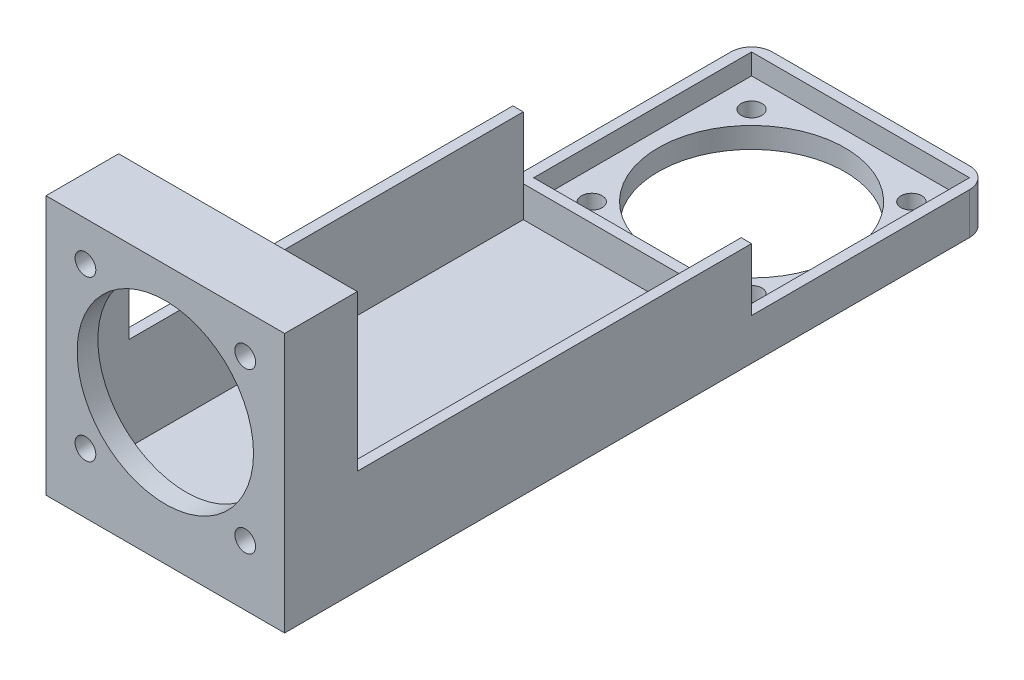
ISO-10303-21;
HEADER;
FILE_DESCRIPTION(('STEP AP214'),'2;1');
FILE_NAME('part.step','',(''),(''),'','','');
FILE_SCHEMA(('AUTOMOTIVE_DESIGN { 1 0 10303 214 1 1 1 1 }'));
ENDSEC;
DATA;
#1=APPLICATION_CONTEXT('core data for automotive mechanical design processes');
#2=APPLICATION_PROTOCOL_DEFINITION('international standard','automotive_design',2000,#1);
#3=PRODUCT_CONTEXT('',#1,'mechanical');
#4=PRODUCT('Part','Part','',(#3));
#5=PRODUCT_RELATED_PRODUCT_CATEGORY('part','',(#4));
#6=PRODUCT_DEFINITION_FORMATION('','',#4);
#7=PRODUCT_DEFINITION_CONTEXT('part definition',#1,'design');
#8=PRODUCT_DEFINITION('design','',#6,#7);
#9=PRODUCT_DEFINITION_SHAPE('','',#8);
#10=(LENGTH_UNIT() NAMED_UNIT(*) SI_UNIT(.MILLI.,.METRE.));
#11=(NAMED_UNIT(*) PLANE_ANGLE_UNIT() SI_UNIT($,.RADIAN.));
#12=(NAMED_UNIT(*) SI_UNIT($,.STERADIAN.) SOLID_ANGLE_UNIT());
#13=UNCERTAINTY_MEASURE_WITH_UNIT(LENGTH_MEASURE(1.E-05),#10,'distance_accuracy_value','');
#14=(GEOMETRIC_REPRESENTATION_CONTEXT(3) GLOBAL_UNCERTAINTY_ASSIGNED_CONTEXT((#13)) GLOBAL_UNIT_ASSIGNED_CONTEXT((#10,
#11,#12)) REPRESENTATION_CONTEXT('',''));
#15=CARTESIAN_POINT('',(0.,0.,0.));
#16=DIRECTION('',(0.,0.,1.));
#17=DIRECTION('',(1.,0.,0.));
#18=AXIS2_PLACEMENT_3D('',#15,#16,#17);
#19=CARTESIAN_POINT('',(21.,10.,46.));
#20=DIRECTION('',(0.,-1.,0.));
#21=DIRECTION('',(0.,0.,-1.));
#22=AXIS2_PLACEMENT_3D('',#19,#20,#21);
#23=PLANE('',#22);
#24=DIRECTION('',(-1.,0.,0.));
#25=VECTOR('',#24,1.);
#26=CARTESIAN_POINT('',(22.,10.,39.));
#27=LINE('',#26,#25);
#28=CARTESIAN_POINT('',(22.,10.,39.));
#29=VERTEX_POINT('',#28);
#30=CARTESIAN_POINT('',(21.,10.,39.));
#31=VERTEX_POINT('',#30);
#32=EDGE_CURVE('E224',#29,#31,#27,.T.);
#33=ORIENTED_EDGE('',*,*,#32,.F.);
#34=DIRECTION('',(0.,0.,-1.));
#35=VECTOR('',#34,1.);
#36=CARTESIAN_POINT('',(22.,10.,46.));
#37=LINE('',#36,#35);
#38=CARTESIAN_POINT('',(22.,10.,1.));
#39=VERTEX_POINT('',#38);
#40=EDGE_CURVE('E240',#29,#39,#37,.T.);
#41=ORIENTED_EDGE('',*,*,#40,.T.);
#42=DIRECTION('',(-1.,0.,0.));
#43=VECTOR('',#42,1.);
#44=CARTESIAN_POINT('',(21.,10.,1.));
#45=LINE('',#44,#43);
#46=CARTESIAN_POINT('',(21.,10.,1.));
#47=VERTEX_POINT('',#46);
#48=EDGE_CURVE('E237',#39,#47,#45,.T.);
#49=ORIENTED_EDGE('',*,*,#48,.T.);
#50=DIRECTION('',(0.,0.,-1.));
#51=VECTOR('',#50,1.);
#52=CARTESIAN_POINT('',(21.,10.,46.));
#53=LINE('',#52,#51);
#54=EDGE_CURVE('E216',#31,#47,#53,.T.);
#55=ORIENTED_EDGE('',*,*,#54,.F.);
#56=EDGE_LOOP('',(#33,#41,#49,#55));
#57=FACE_BOUND('',#56,.T.);
#58=ADVANCED_FACE('F65',(#57),#23,.F.);
#59=CARTESIAN_POINT('',(-1.,10.,46.));
#60=DIRECTION('',(0.,-1.,0.));
#61=DIRECTION('',(0.,0.,-1.));
#62=AXIS2_PLACEMENT_3D('',#59,#60,#61);
#63=PLANE('',#62);
#64=DIRECTION('',(-1.,0.,0.));
#65=VECTOR('',#64,1.);
#66=CARTESIAN_POINT('',(-1.,10.,39.));
#67=LINE('',#66,#65);
#68=CARTESIAN_POINT('',(0.,10.,39.));
#69=VERTEX_POINT('',#68);
#70=CARTESIAN_POINT('',(-1.,10.,39.));
#71=VERTEX_POINT('',#70);
#72=EDGE_CURVE('E424',#69,#71,#67,.T.);
#73=ORIENTED_EDGE('',*,*,#72,.F.);
#74=DIRECTION('',(0.,0.,-1.));
#75=VECTOR('',#74,1.);
#76=CARTESIAN_POINT('',(0.,10.,46.));
#77=LINE('',#76,#75);
#78=CARTESIAN_POINT('',(0.,10.,1.));
#79=VERTEX_POINT('',#78);
#80=EDGE_CURVE('E384',#69,#79,#77,.T.);
#81=ORIENTED_EDGE('',*,*,#80,.T.);
#82=DIRECTION('',(-1.,0.,0.));
#83=VECTOR('',#82,1.);
#84=CARTESIAN_POINT('',(-1.,10.,1.));
#85=LINE('',#84,#83);
#86=CARTESIAN_POINT('',(-1.,10.,1.));
#87=VERTEX_POINT('',#86);
#88=EDGE_CURVE('E410',#79,#87,#85,.T.);
#89=ORIENTED_EDGE('',*,*,#88,.T.);
#90=DIRECTION('',(0.,0.,-1.));
#91=VECTOR('',#90,1.);
#92=CARTESIAN_POINT('',(-1.,10.,46.));
#93=LINE('',#92,#91);
#94=EDGE_CURVE('E379',#71,#87,#93,.T.);
#95=ORIENTED_EDGE('',*,*,#94,.F.);
#96=EDGE_LOOP('',(#73,#81,#89,#95));
#97=FACE_BOUND('',#96,.T.);
#98=ADVANCED_FACE('F420',(#97),#63,.F.);
#99=CARTESIAN_POINT('',(22.,25.,44.));
#100=DIRECTION('',(0.,0.,1.));
#101=DIRECTION('',(1.,0.,0.));
#102=AXIS2_PLACEMENT_3D('',#99,#100,#101);
#103=PLANE('',#102);
#104=CARTESIAN_POINT('',(18.2,21.2,44.));
#105=DIRECTION('',(0.,0.,1.));
#106=DIRECTION('',(1.,0.,0.));
#107=AXIS2_PLACEMENT_3D('',#104,#105,#106);
#108=CIRCLE('',#107,1.);
#109=CARTESIAN_POINT('',(19.2,21.2,44.));
#110=VERTEX_POINT('',#109);
#111=EDGE_CURVE('E458',#110,#110,#108,.T.);
#112=ORIENTED_EDGE('',*,*,#111,.T.);
#113=EDGE_LOOP('',(#112));
#114=FACE_BOUND('',#113,.T.);
#115=CARTESIAN_POINT('',(18.2,5.8,44.));
#116=DIRECTION('',(0.,0.,1.));
#117=DIRECTION('',(1.,0.,0.));
#118=AXIS2_PLACEMENT_3D('',#115,#116,#117);
#119=CIRCLE('',#118,1.);
#120=CARTESIAN_POINT('',(19.2,5.8,44.));
#121=VERTEX_POINT('',#120);
#122=EDGE_CURVE('E887',#121,#121,#119,.T.);
#123=ORIENTED_EDGE('',*,*,#122,.T.);
#124=EDGE_LOOP('',(#123));
#125=FACE_BOUND('',#124,.T.);
#126=CARTESIAN_POINT('',(10.5,13.5,44.));
#127=DIRECTION('',(0.,0.,1.));
#128=DIRECTION('',(1.,0.,0.));
#129=AXIS2_PLACEMENT_3D('',#126,#127,#128);
#130=CIRCLE('',#129,8.5);
#131=CARTESIAN_POINT('',(19.,13.5,44.));
#132=VERTEX_POINT('',#131);
#133=EDGE_CURVE('E891',#132,#132,#130,.T.);
#134=ORIENTED_EDGE('',*,*,#133,.T.);
#135=EDGE_LOOP('',(#134));
#136=FACE_BOUND('',#135,.T.);
#137=CARTESIAN_POINT('',(2.8,5.8,44.));
#138=DIRECTION('',(0.,0.,1.));
#139=DIRECTION('',(1.,0.,0.));
#140=AXIS2_PLACEMENT_3D('',#137,#138,#139);
#141=CIRCLE('',#140,1.);
#142=CARTESIAN_POINT('',(3.8,5.8,44.));
#143=VERTEX_POINT('',#142);
#144=EDGE_CURVE('E903',#143,#143,#141,.T.);
#145=ORIENTED_EDGE('',*,*,#144,.T.);
#146=EDGE_LOOP('',(#145));
#147=FACE_BOUND('',#146,.T.);
#148=CARTESIAN_POINT('',(2.8,21.2,44.));
#149=DIRECTION('',(0.,0.,1.));
#150=DIRECTION('',(1.,0.,0.));
#151=AXIS2_PLACEMENT_3D('',#148,#149,#150);
#152=CIRCLE('',#151,1.);
#153=CARTESIAN_POINT('',(3.8,21.2,44.));
#154=VERTEX_POINT('',#153);
#155=EDGE_CURVE('E907',#154,#154,#152,.T.);
#156=ORIENTED_EDGE('',*,*,#155,.T.);
#157=EDGE_LOOP('',(#156));
#158=FACE_BOUND('',#157,.T.);
#159=DIRECTION('',(-1.,0.,0.));
#160=VECTOR('',#159,1.);
#161=CARTESIAN_POINT('',(0.,24.,44.));
#162=LINE('',#161,#160);
#163=CARTESIAN_POINT('',(21.,24.,44.));
#164=VERTEX_POINT('',#163);
#165=CARTESIAN_POINT('',(0.,24.,44.));
#166=VERTEX_POINT('',#165);
#167=EDGE_CURVE('E234',#164,#166,#162,.T.);
#168=ORIENTED_EDGE('',*,*,#167,.F.);
#169=DIRECTION('',(0.,-1.,0.));
#170=VECTOR('',#169,1.);
#171=CARTESIAN_POINT('',(21.,1.,44.));
#172=LINE('',#171,#170);
#173=CARTESIAN_POINT('',(21.,1.,44.));
#174=VERTEX_POINT('',#173);
#175=EDGE_CURVE('E395',#164,#174,#172,.T.);
#176=ORIENTED_EDGE('',*,*,#175,.T.);
#177=DIRECTION('',(-1.,0.,0.));
#178=VECTOR('',#177,1.);
#179=CARTESIAN_POINT('',(22.,1.,44.));
#180=LINE('',#179,#178);
#181=CARTESIAN_POINT('',(0.,1.,44.));
#182=VERTEX_POINT('',#181);
#183=EDGE_CURVE('E496',#174,#182,#180,.T.);
#184=ORIENTED_EDGE('',*,*,#183,.T.);
#185=DIRECTION('',(0.,1.,0.));
#186=VECTOR('',#185,1.);
#187=CARTESIAN_POINT('',(0.,10.,44.));
#188=LINE('',#187,#186);
#189=EDGE_CURVE('E504',#182,#166,#188,.T.);
#190=ORIENTED_EDGE('',*,*,#189,.T.);
#191=EDGE_LOOP('',(#168,#176,#184,#190));
#192=FACE_BOUND('',#191,.T.);
#193=ADVANCED_FACE('F544',(#114,#125,#136,#147,#158,#192),#103,.F.);
#194=CARTESIAN_POINT('',(21.,1.,46.));
#195=DIRECTION('',(1.,0.,0.));
#196=DIRECTION('',(0.,0.,-1.));
#197=AXIS2_PLACEMENT_3D('',#194,#195,#196);
#198=PLANE('',#197);
#199=ORIENTED_EDGE('',*,*,#175,.F.);
#200=DIRECTION('',(0.,0.,1.));
#201=VECTOR('',#200,1.);
#202=CARTESIAN_POINT('',(21.,24.,39.));
#203=LINE('',#202,#201);
#204=CARTESIAN_POINT('',(21.,24.,39.));
#205=VERTEX_POINT('',#204);
#206=EDGE_CURVE('E219',#205,#164,#203,.T.);
#207=ORIENTED_EDGE('',*,*,#206,.F.);
#208=DIRECTION('',(0.,1.,0.));
#209=VECTOR('',#208,1.);
#210=CARTESIAN_POINT('',(21.,24.,39.));
#211=LINE('',#210,#209);
#212=EDGE_CURVE('E211',#31,#205,#211,.T.);
#213=ORIENTED_EDGE('',*,*,#212,.F.);
#214=ORIENTED_EDGE('',*,*,#54,.T.);
#215=DIRECTION('',(0.,-1.,0.));
#216=VECTOR('',#215,1.);
#217=CARTESIAN_POINT('',(21.,1.,1.));
#218=LINE('',#217,#216);
#219=CARTESIAN_POINT('',(21.,4.,1.));
#220=VERTEX_POINT('',#219);
#221=EDGE_CURVE('E76',#47,#220,#218,.T.);
#222=ORIENTED_EDGE('',*,*,#221,.T.);
#223=CARTESIAN_POINT('',(21.,1.,1.));
#224=VERTEX_POINT('',#223);
#225=EDGE_CURVE('E12',#220,#224,#218,.T.);
#226=ORIENTED_EDGE('',*,*,#225,.T.);
#227=DIRECTION('',(0.,0.,-1.));
#228=VECTOR('',#227,1.);
#229=CARTESIAN_POINT('',(21.,1.,46.));
#230=LINE('',#229,#228);
#231=EDGE_CURVE('E241',#174,#224,#230,.T.);
#232=ORIENTED_EDGE('',*,*,#231,.F.);
#233=EDGE_LOOP('',(#199,#207,#213,#214,#222,#226,#232));
#234=FACE_BOUND('',#233,.T.);
#235=ADVANCED_FACE('F213',(#234),#198,.F.);
#236=CARTESIAN_POINT('',(0.,1.,46.));
#237=DIRECTION('',(0.,-1.,0.));
#238=DIRECTION('',(0.,0.,-1.));
#239=AXIS2_PLACEMENT_3D('',#236,#237,#238);
#240=PLANE('',#239);
#241=ORIENTED_EDGE('',*,*,#183,.F.);
#242=ORIENTED_EDGE('',*,*,#231,.T.);
#243=DIRECTION('',(-1.,0.,0.));
#244=VECTOR('',#243,1.);
#245=CARTESIAN_POINT('',(0.,1.,1.));
#246=LINE('',#245,#244);
#247=CARTESIAN_POINT('',(0.,1.,1.));
#248=VERTEX_POINT('',#247);
#249=EDGE_CURVE('E402',#224,#248,#246,.T.);
#250=ORIENTED_EDGE('',*,*,#249,.T.);
#251=DIRECTION('',(0.,0.,-1.));
#252=VECTOR('',#251,1.);
#253=CARTESIAN_POINT('',(0.,1.,46.));
#254=LINE('',#253,#252);
#255=EDGE_CURVE('E83',#182,#248,#254,.T.);
#256=ORIENTED_EDGE('',*,*,#255,.F.);
#257=EDGE_LOOP('',(#241,#242,#250,#256));
#258=FACE_BOUND('',#257,.T.);
#259=ADVANCED_FACE('F524',(#258),#240,.F.);
#260=CARTESIAN_POINT('',(0.,10.,46.));
#261=DIRECTION('',(-1.,0.,0.));
#262=DIRECTION('',(0.,-1.,0.));
#263=AXIS2_PLACEMENT_3D('',#260,#261,#262);
#264=PLANE('',#263);
#265=ORIENTED_EDGE('',*,*,#189,.F.);
#266=ORIENTED_EDGE('',*,*,#255,.T.);
#267=DIRECTION('',(0.,1.,0.));
#268=VECTOR('',#267,1.);
#269=CARTESIAN_POINT('',(0.,10.,1.));
#270=LINE('',#269,#268);
#271=CARTESIAN_POINT('',(0.,4.,1.));
#272=VERTEX_POINT('',#271);
#273=EDGE_CURVE('E407',#248,#272,#270,.T.);
#274=ORIENTED_EDGE('',*,*,#273,.T.);
#275=EDGE_CURVE('E406',#272,#79,#270,.T.);
#276=ORIENTED_EDGE('',*,*,#275,.T.);
#277=ORIENTED_EDGE('',*,*,#80,.F.);
#278=DIRECTION('',(0.,-1.,0.));
#279=VECTOR('',#278,1.);
#280=CARTESIAN_POINT('',(0.,10.,39.));
#281=LINE('',#280,#279);
#282=CARTESIAN_POINT('',(0.,24.,39.));
#283=VERTEX_POINT('',#282);
#284=EDGE_CURVE('E448',#283,#69,#281,.T.);
#285=ORIENTED_EDGE('',*,*,#284,.F.);
#286=DIRECTION('',(0.,0.,1.));
#287=VECTOR('',#286,1.);
#288=CARTESIAN_POINT('',(0.,24.,39.));
#289=LINE('',#288,#287);
#290=EDGE_CURVE('E454',#283,#166,#289,.T.);
#291=ORIENTED_EDGE('',*,*,#290,.T.);
#292=EDGE_LOOP('',(#265,#266,#274,#276,#277,#285,#291));
#293=FACE_BOUND('',#292,.T.);
#294=ADVANCED_FACE('F427',(#293),#264,.F.);
#295=CARTESIAN_POINT('',(-1.,4.,1.));
#296=DIRECTION('',(0.,0.,-1.));
#297=DIRECTION('',(-1.,0.,0.));
#298=AXIS2_PLACEMENT_3D('',#295,#296,#297);
#299=PLANE('',#298);
#300=ORIENTED_EDGE('',*,*,#273,.F.);
#301=ORIENTED_EDGE('',*,*,#249,.F.);
#302=ORIENTED_EDGE('',*,*,#225,.F.);
#303=DIRECTION('',(1.,0.,0.));
#304=VECTOR('',#303,1.);
#305=CARTESIAN_POINT('',(-1.,4.,1.));
#306=LINE('',#305,#304);
#307=EDGE_CURVE('E318',#272,#220,#306,.T.);
#308=ORIENTED_EDGE('',*,*,#307,.F.);
#309=EDGE_LOOP('',(#300,#301,#302,#308));
#310=FACE_BOUND('',#309,.T.);
#311=ADVANCED_FACE('F525',(#310),#299,.F.);
#312=CARTESIAN_POINT('',(0.,4.,0.));
#313=DIRECTION('',(1.,0.,0.));
#314=DIRECTION('',(0.,0.,-1.));
#315=AXIS2_PLACEMENT_3D('',#312,#313,#314);
#316=PLANE('',#315);
#317=DIRECTION('',(0.,-1.,0.));
#318=VECTOR('',#317,1.);
#319=CARTESIAN_POINT('',(0.,4.,0.));
#320=LINE('',#319,#318);
#321=CARTESIAN_POINT('',(0.,4.,0.));
#322=VERTEX_POINT('',#321);
#323=CARTESIAN_POINT('',(0.,2.,0.));
#324=VERTEX_POINT('',#323);
#325=EDGE_CURVE('E296',#322,#324,#320,.T.);
#326=ORIENTED_EDGE('',*,*,#325,.T.);
#327=DIRECTION('',(0.,0.,1.));
#328=VECTOR('',#327,1.);
#329=CARTESIAN_POINT('',(0.,2.,-21.));
#330=LINE('',#329,#328);
#331=CARTESIAN_POINT('',(0.,2.,-21.));
#332=VERTEX_POINT('',#331);
#333=EDGE_CURVE('E268',#332,#324,#330,.T.);
#334=ORIENTED_EDGE('',*,*,#333,.F.);
#335=DIRECTION('',(0.,-1.,0.));
#336=VECTOR('',#335,1.);
#337=CARTESIAN_POINT('',(0.,4.,-21.));
#338=LINE('',#337,#336);
#339=CARTESIAN_POINT('',(0.,4.,-21.));
#340=VERTEX_POINT('',#339);
#341=EDGE_CURVE('E284',#340,#332,#338,.T.);
#342=ORIENTED_EDGE('',*,*,#341,.F.);
#343=DIRECTION('',(0.,0.,1.));
#344=VECTOR('',#343,1.);
#345=CARTESIAN_POINT('',(0.,4.,0.));
#346=LINE('',#345,#344);
#347=EDGE_CURVE('E271',#340,#322,#346,.T.);
#348=ORIENTED_EDGE('',*,*,#347,.T.);
#349=EDGE_LOOP('',(#326,#334,#342,#348));
#350=FACE_BOUND('',#349,.T.);
#351=ADVANCED_FACE('F527',(#350),#316,.T.);
#352=CARTESIAN_POINT('',(0.,4.,0.));
#353=DIRECTION('',(0.,0.,-1.));
#354=DIRECTION('',(-1.,0.,0.));
#355=AXIS2_PLACEMENT_3D('',#352,#353,#354);
#356=PLANE('',#355);
#357=DIRECTION('',(0.,-1.,0.));
#358=VECTOR('',#357,1.);
#359=CARTESIAN_POINT('',(21.,4.,0.));
#360=LINE('',#359,#358);
#361=CARTESIAN_POINT('',(21.,4.,0.));
#362=VERTEX_POINT('',#361);
#363=CARTESIAN_POINT('',(21.,2.,0.));
#364=VERTEX_POINT('',#363);
#365=EDGE_CURVE('E292',#362,#364,#360,.T.);
#366=ORIENTED_EDGE('',*,*,#365,.T.);
#367=DIRECTION('',(1.,0.,0.));
#368=VECTOR('',#367,1.);
#369=CARTESIAN_POINT('',(0.,2.,0.));
#370=LINE('',#369,#368);
#371=EDGE_CURVE('E254',#324,#364,#370,.T.);
#372=ORIENTED_EDGE('',*,*,#371,.F.);
#373=ORIENTED_EDGE('',*,*,#325,.F.);
#374=DIRECTION('',(1.,0.,0.));
#375=VECTOR('',#374,1.);
#376=CARTESIAN_POINT('',(0.,4.,0.));
#377=LINE('',#376,#375);
#378=EDGE_CURVE('E274',#322,#362,#377,.T.);
#379=ORIENTED_EDGE('',*,*,#378,.T.);
#380=EDGE_LOOP('',(#366,#372,#373,#379));
#381=FACE_BOUND('',#380,.T.);
#382=ADVANCED_FACE('F533',(#381),#356,.T.);
#383=CARTESIAN_POINT('',(21.,4.,0.));
#384=DIRECTION('',(-1.,0.,0.));
#385=DIRECTION('',(0.,0.,1.));
#386=AXIS2_PLACEMENT_3D('',#383,#384,#385);
#387=PLANE('',#386);
#388=DIRECTION('',(0.,-1.,0.));
#389=VECTOR('',#388,1.);
#390=CARTESIAN_POINT('',(21.,4.,-21.));
#391=LINE('',#390,#389);
#392=CARTESIAN_POINT('',(21.,4.,-21.));
#393=VERTEX_POINT('',#392);
#394=CARTESIAN_POINT('',(21.,2.,-21.));
#395=VERTEX_POINT('',#394);
#396=EDGE_CURVE('E288',#393,#395,#391,.T.);
#397=ORIENTED_EDGE('',*,*,#396,.T.);
#398=DIRECTION('',(0.,0.,1.));
#399=VECTOR('',#398,1.);
#400=CARTESIAN_POINT('',(21.,2.,-21.));
#401=LINE('',#400,#399);
#402=EDGE_CURVE('E260',#395,#364,#401,.T.);
#403=ORIENTED_EDGE('',*,*,#402,.T.);
#404=ORIENTED_EDGE('',*,*,#365,.F.);
#405=DIRECTION('',(0.,0.,-1.));
#406=VECTOR('',#405,1.);
#407=CARTESIAN_POINT('',(21.,4.,0.));
#408=LINE('',#407,#406);
#409=EDGE_CURVE('E277',#362,#393,#408,.T.);
#410=ORIENTED_EDGE('',*,*,#409,.T.);
#411=EDGE_LOOP('',(#397,#403,#404,#410));
#412=FACE_BOUND('',#411,.T.);
#413=ADVANCED_FACE('F560',(#412),#387,.T.);
#414=CARTESIAN_POINT('',(0.,4.,-21.));
#415=DIRECTION('',(0.,0.,1.));
#416=DIRECTION('',(1.,0.,0.));
#417=AXIS2_PLACEMENT_3D('',#414,#415,#416);
#418=PLANE('',#417);
#419=ORIENTED_EDGE('',*,*,#341,.T.);
#420=DIRECTION('',(1.,0.,0.));
#421=VECTOR('',#420,1.);
#422=CARTESIAN_POINT('',(0.,2.,-21.));
#423=LINE('',#422,#421);
#424=EDGE_CURVE('E264',#332,#395,#423,.T.);
#425=ORIENTED_EDGE('',*,*,#424,.T.);
#426=ORIENTED_EDGE('',*,*,#396,.F.);
#427=DIRECTION('',(-1.,0.,0.));
#428=VECTOR('',#427,1.);
#429=CARTESIAN_POINT('',(0.,4.,-21.));
#430=LINE('',#429,#428);
#431=EDGE_CURVE('E281',#393,#340,#430,.T.);
#432=ORIENTED_EDGE('',*,*,#431,.T.);
#433=EDGE_LOOP('',(#419,#425,#426,#432));
#434=FACE_BOUND('',#433,.T.);
#435=ADVANCED_FACE('F557',(#434),#418,.T.);
#436=CARTESIAN_POINT('',(0.,4.,0.));
#437=DIRECTION('',(0.,-1.,0.));
#438=DIRECTION('',(0.,0.,-1.));
#439=AXIS2_PLACEMENT_3D('',#436,#437,#438);
#440=PLANE('',#439);
#441=DIRECTION('',(0.,0.,-1.));
#442=VECTOR('',#441,1.);
#443=CARTESIAN_POINT('',(22.,4.,1.));
#444=LINE('',#443,#442);
#445=CARTESIAN_POINT('',(22.,4.,1.));
#446=VERTEX_POINT('',#445);
#447=CARTESIAN_POINT('',(22.,4.,-20.));
#448=VERTEX_POINT('',#447);
#449=EDGE_CURVE('E301',#446,#448,#444,.T.);
#450=ORIENTED_EDGE('',*,*,#449,.T.);
#451=CARTESIAN_POINT('',(20.,4.,-20.));
#452=DIRECTION('',(0.,-1.,0.));
#453=DIRECTION('',(0.,0.,-1.));
#454=AXIS2_PLACEMENT_3D('',#451,#452,#453);
#455=CIRCLE('',#454,2.);
#456=CARTESIAN_POINT('',(20.,4.,-22.));
#457=VERTEX_POINT('',#456);
#458=EDGE_CURVE('E69',#448,#457,#455,.F.);
#459=ORIENTED_EDGE('',*,*,#458,.T.);
#460=DIRECTION('',(-1.,0.,0.));
#461=VECTOR('',#460,1.);
#462=CARTESIAN_POINT('',(-1.,4.,-22.));
#463=LINE('',#462,#461);
#464=CARTESIAN_POINT('',(1.,4.,-22.));
#465=VERTEX_POINT('',#464);
#466=EDGE_CURVE('E305',#457,#465,#463,.T.);
#467=ORIENTED_EDGE('',*,*,#466,.T.);
#468=CARTESIAN_POINT('',(1.,4.,-20.));
#469=DIRECTION('',(0.,-1.,0.));
#470=DIRECTION('',(0.,0.,-1.));
#471=AXIS2_PLACEMENT_3D('',#468,#469,#470);
#472=CIRCLE('',#471,2.);
#473=CARTESIAN_POINT('',(-1.,4.,-20.));
#474=VERTEX_POINT('',#473);
#475=EDGE_CURVE('E339',#465,#474,#472,.F.);
#476=ORIENTED_EDGE('',*,*,#475,.T.);
#477=DIRECTION('',(0.,0.,1.));
#478=VECTOR('',#477,1.);
#479=CARTESIAN_POINT('',(-1.,4.,1.));
#480=LINE('',#479,#478);
#481=CARTESIAN_POINT('',(-1.,4.,1.));
#482=VERTEX_POINT('',#481);
#483=EDGE_CURVE('E309',#474,#482,#480,.T.);
#484=ORIENTED_EDGE('',*,*,#483,.T.);
#485=EDGE_CURVE('E313',#482,#272,#306,.T.);
#486=ORIENTED_EDGE('',*,*,#485,.T.);
#487=ORIENTED_EDGE('',*,*,#307,.T.);
#488=EDGE_CURVE('E312',#220,#446,#306,.T.);
#489=ORIENTED_EDGE('',*,*,#488,.T.);
#490=EDGE_LOOP('',(#450,#459,#467,#476,#484,#486,#487,#489));
#491=FACE_BOUND('',#490,.T.);
#492=ORIENTED_EDGE('',*,*,#347,.F.);
#493=ORIENTED_EDGE('',*,*,#431,.F.);
#494=ORIENTED_EDGE('',*,*,#409,.F.);
#495=ORIENTED_EDGE('',*,*,#378,.F.);
#496=EDGE_LOOP('',(#492,#493,#494,#495));
#497=FACE_BOUND('',#496,.T.);
#498=ADVANCED_FACE('F357',(#491,#497),#440,.F.);
#499=CARTESIAN_POINT('',(0.,0.,0.));
#500=DIRECTION('',(0.,-1.,0.));
#501=DIRECTION('',(0.,0.,-1.));
#502=AXIS2_PLACEMENT_3D('',#499,#500,#501);
#503=PLANE('',#502);
#504=CARTESIAN_POINT('',(18.2,0.,-18.2));
#505=DIRECTION('',(0.,-1.,0.));
#506=DIRECTION('',(0.,0.,-1.));
#507=AXIS2_PLACEMENT_3D('',#504,#505,#506);
#508=CIRCLE('',#507,1.);
#509=CARTESIAN_POINT('',(18.2,0.,-19.2));
#510=VERTEX_POINT('',#509);
#511=EDGE_CURVE('E492',#510,#510,#508,.T.);
#512=ORIENTED_EDGE('',*,*,#511,.F.);
#513=EDGE_LOOP('',(#512));
#514=FACE_BOUND('',#513,.T.);
#515=CARTESIAN_POINT('',(18.2,0.,-2.8));
#516=DIRECTION('',(0.,-1.,0.));
#517=DIRECTION('',(0.,0.,-1.));
#518=AXIS2_PLACEMENT_3D('',#515,#516,#517);
#519=CIRCLE('',#518,1.);
#520=CARTESIAN_POINT('',(18.2,0.,-3.8));
#521=VERTEX_POINT('',#520);
#522=EDGE_CURVE('E488',#521,#521,#519,.T.);
#523=ORIENTED_EDGE('',*,*,#522,.F.);
#524=EDGE_LOOP('',(#523));
#525=FACE_BOUND('',#524,.T.);
#526=CARTESIAN_POINT('',(2.8,0.,-2.8));
#527=DIRECTION('',(0.,-1.,0.));
#528=DIRECTION('',(0.,0.,-1.));
#529=AXIS2_PLACEMENT_3D('',#526,#527,#528);
#530=CIRCLE('',#529,1.);
#531=CARTESIAN_POINT('',(2.8,0.,-3.8));
#532=VERTEX_POINT('',#531);
#533=EDGE_CURVE('E484',#532,#532,#530,.T.);
#534=ORIENTED_EDGE('',*,*,#533,.F.);
#535=EDGE_LOOP('',(#534));
#536=FACE_BOUND('',#535,.T.);
#537=CARTESIAN_POINT('',(2.8,0.,-18.2));
#538=DIRECTION('',(0.,-1.,0.));
#539=DIRECTION('',(0.,0.,-1.));
#540=AXIS2_PLACEMENT_3D('',#537,#538,#539);
#541=CIRCLE('',#540,1.);
#542=CARTESIAN_POINT('',(2.8,0.,-19.2));
#543=VERTEX_POINT('',#542);
#544=EDGE_CURVE('E480',#543,#543,#541,.T.);
#545=ORIENTED_EDGE('',*,*,#544,.F.);
#546=EDGE_LOOP('',(#545));
#547=FACE_BOUND('',#546,.T.);
#548=CARTESIAN_POINT('',(10.5,0.,-10.5));
#549=DIRECTION('',(0.,1.,0.));
#550=DIRECTION('',(0.,0.,1.));
#551=AXIS2_PLACEMENT_3D('',#548,#549,#550);
#552=CIRCLE('',#551,9.00000000000001);
#553=CARTESIAN_POINT('',(10.5,0.,-1.49999999999999));
#554=VERTEX_POINT('',#553);
#555=EDGE_CURVE('E250',#554,#554,#552,.T.);
#556=ORIENTED_EDGE('',*,*,#555,.T.);
#557=EDGE_LOOP('',(#556));
#558=FACE_BOUND('',#557,.T.);
#559=DIRECTION('',(-1.,0.,0.));
#560=VECTOR('',#559,1.);
#561=CARTESIAN_POINT('',(-1.,0.,-22.));
#562=LINE('',#561,#560);
#563=CARTESIAN_POINT('',(20.,0.,-22.));
#564=VERTEX_POINT('',#563);
#565=CARTESIAN_POINT('',(1.,0.,-22.));
#566=VERTEX_POINT('',#565);
#567=EDGE_CURVE('E322',#564,#566,#562,.T.);
#568=ORIENTED_EDGE('',*,*,#567,.F.);
#569=CARTESIAN_POINT('',(20.,0.,-20.));
#570=DIRECTION('',(0.,-1.,0.));
#571=DIRECTION('',(0.,0.,-1.));
#572=AXIS2_PLACEMENT_3D('',#569,#570,#571);
#573=CIRCLE('',#572,2.);
#574=CARTESIAN_POINT('',(22.,0.,-20.));
#575=VERTEX_POINT('',#574);
#576=EDGE_CURVE('E346',#564,#575,#573,.T.);
#577=ORIENTED_EDGE('',*,*,#576,.T.);
#578=DIRECTION('',(0.,0.,-1.));
#579=VECTOR('',#578,1.);
#580=CARTESIAN_POINT('',(22.,0.,1.));
#581=LINE('',#580,#579);
#582=CARTESIAN_POINT('',(22.,0.,46.));
#583=VERTEX_POINT('',#582);
#584=EDGE_CURVE('E300',#583,#575,#581,.T.);
#585=ORIENTED_EDGE('',*,*,#584,.F.);
#586=DIRECTION('',(1.,0.,0.));
#587=VECTOR('',#586,1.);
#588=CARTESIAN_POINT('',(-1.,0.,46.));
#589=LINE('',#588,#587);
#590=CARTESIAN_POINT('',(-1.,0.,46.));
#591=VERTEX_POINT('',#590);
#592=EDGE_CURVE('E380',#591,#583,#589,.T.);
#593=ORIENTED_EDGE('',*,*,#592,.F.);
#594=DIRECTION('',(0.,0.,1.));
#595=VECTOR('',#594,1.);
#596=CARTESIAN_POINT('',(-1.,0.,1.));
#597=LINE('',#596,#595);
#598=CARTESIAN_POINT('',(-1.,0.,-20.));
#599=VERTEX_POINT('',#598);
#600=EDGE_CURVE('E306',#599,#591,#597,.T.);
#601=ORIENTED_EDGE('',*,*,#600,.F.);
#602=CARTESIAN_POINT('',(1.,0.,-20.));
#603=DIRECTION('',(0.,-1.,0.));
#604=DIRECTION('',(0.,0.,-1.));
#605=AXIS2_PLACEMENT_3D('',#602,#603,#604);
#606=CIRCLE('',#605,2.);
#607=EDGE_CURVE('E331',#599,#566,#606,.T.);
#608=ORIENTED_EDGE('',*,*,#607,.T.);
#609=EDGE_LOOP('',(#568,#577,#585,#593,#601,#608));
#610=FACE_BOUND('',#609,.T.);
#611=ADVANCED_FACE('F367',(#514,#525,#536,#547,#558,#610),#503,.T.);
#612=CARTESIAN_POINT('',(22.,4.,1.));
#613=DIRECTION('',(-1.,0.,0.));
#614=DIRECTION('',(0.,0.,1.));
#615=AXIS2_PLACEMENT_3D('',#612,#613,#614);
#616=PLANE('',#615);
#617=ORIENTED_EDGE('',*,*,#40,.F.);
#618=DIRECTION('',(0.,-1.,0.));
#619=VECTOR('',#618,1.);
#620=CARTESIAN_POINT('',(22.,10.,39.));
#621=LINE('',#620,#619);
#622=CARTESIAN_POINT('',(22.,25.,39.));
#623=VERTEX_POINT('',#622);
#624=EDGE_CURVE('E230',#623,#29,#621,.T.);
#625=ORIENTED_EDGE('',*,*,#624,.F.);
#626=DIRECTION('',(0.,0.,-1.));
#627=VECTOR('',#626,1.);
#628=CARTESIAN_POINT('',(22.,25.,46.));
#629=LINE('',#628,#627);
#630=CARTESIAN_POINT('',(22.,25.,46.));
#631=VERTEX_POINT('',#630);
#632=EDGE_CURVE('E374',#631,#623,#629,.T.);
#633=ORIENTED_EDGE('',*,*,#632,.F.);
#634=DIRECTION('',(0.,1.,0.));
#635=VECTOR('',#634,1.);
#636=CARTESIAN_POINT('',(22.,0.,46.));
#637=LINE('',#636,#635);
#638=EDGE_CURVE('E373',#583,#631,#637,.T.);
#639=ORIENTED_EDGE('',*,*,#638,.F.);
#640=ORIENTED_EDGE('',*,*,#584,.T.);
#641=DIRECTION('',(0.,-1.,0.));
#642=VECTOR('',#641,1.);
#643=CARTESIAN_POINT('',(22.,4.,-20.));
#644=LINE('',#643,#642);
#645=EDGE_CURVE('E348',#575,#448,#644,.F.);
#646=ORIENTED_EDGE('',*,*,#645,.T.);
#647=ORIENTED_EDGE('',*,*,#449,.F.);
#648=DIRECTION('',(0.,1.,0.));
#649=VECTOR('',#648,1.);
#650=CARTESIAN_POINT('',(22.,0.,1.));
#651=LINE('',#650,#649);
#652=EDGE_CURVE('E394',#446,#39,#651,.T.);
#653=ORIENTED_EDGE('',*,*,#652,.T.);
#654=EDGE_LOOP('',(#617,#625,#633,#639,#640,#646,#647,#653));
#655=FACE_BOUND('',#654,.T.);
#656=ADVANCED_FACE('F371',(#655),#616,.F.);
#657=CARTESIAN_POINT('',(-1.,4.,-22.));
#658=DIRECTION('',(0.,0.,1.));
#659=DIRECTION('',(1.,0.,0.));
#660=AXIS2_PLACEMENT_3D('',#657,#658,#659);
#661=PLANE('',#660);
#662=ORIENTED_EDGE('',*,*,#466,.F.);
#663=DIRECTION('',(0.,-1.,0.));
#664=VECTOR('',#663,1.);
#665=CARTESIAN_POINT('',(20.,4.,-22.));
#666=LINE('',#665,#664);
#667=EDGE_CURVE('E342',#457,#564,#666,.T.);
#668=ORIENTED_EDGE('',*,*,#667,.T.);
#669=ORIENTED_EDGE('',*,*,#567,.T.);
#670=DIRECTION('',(0.,-1.,0.));
#671=VECTOR('',#670,1.);
#672=CARTESIAN_POINT('',(1.,4.,-22.));
#673=LINE('',#672,#671);
#674=EDGE_CURVE('E335',#566,#465,#673,.F.);
#675=ORIENTED_EDGE('',*,*,#674,.T.);
#676=EDGE_LOOP('',(#662,#668,#669,#675));
#677=FACE_BOUND('',#676,.T.);
#678=ADVANCED_FACE('F362',(#677),#661,.F.);
#679=CARTESIAN_POINT('',(-1.,4.,1.));
#680=DIRECTION('',(1.,0.,0.));
#681=DIRECTION('',(0.,0.,-1.));
#682=AXIS2_PLACEMENT_3D('',#679,#680,#681);
#683=PLANE('',#682);
#684=DIRECTION('',(0.,1.,0.));
#685=VECTOR('',#684,1.);
#686=CARTESIAN_POINT('',(-1.,25.,39.));
#687=LINE('',#686,#685);
#688=CARTESIAN_POINT('',(-1.,25.,39.));
#689=VERTEX_POINT('',#688);
#690=EDGE_CURVE('E438',#71,#689,#687,.T.);
#691=ORIENTED_EDGE('',*,*,#690,.F.);
#692=ORIENTED_EDGE('',*,*,#94,.T.);
#693=DIRECTION('',(0.,-1.,0.));
#694=VECTOR('',#693,1.);
#695=CARTESIAN_POINT('',(-1.,0.,1.));
#696=LINE('',#695,#694);
#697=EDGE_CURVE('E390',#87,#482,#696,.T.);
#698=ORIENTED_EDGE('',*,*,#697,.T.);
#699=ORIENTED_EDGE('',*,*,#483,.F.);
#700=DIRECTION('',(0.,-1.,0.));
#701=VECTOR('',#700,1.);
#702=CARTESIAN_POINT('',(-1.,4.,-20.));
#703=LINE('',#702,#701);
#704=EDGE_CURVE('E317',#474,#599,#703,.T.);
#705=ORIENTED_EDGE('',*,*,#704,.T.);
#706=ORIENTED_EDGE('',*,*,#600,.T.);
#707=DIRECTION('',(0.,-1.,0.));
#708=VECTOR('',#707,1.);
#709=CARTESIAN_POINT('',(-1.,0.,46.));
#710=LINE('',#709,#708);
#711=CARTESIAN_POINT('',(-1.,25.,46.));
#712=VERTEX_POINT('',#711);
#713=EDGE_CURVE('E386',#712,#591,#710,.T.);
#714=ORIENTED_EDGE('',*,*,#713,.F.);
#715=DIRECTION('',(0.,0.,1.));
#716=VECTOR('',#715,1.);
#717=CARTESIAN_POINT('',(-1.,25.,44.));
#718=LINE('',#717,#716);
#719=EDGE_CURVE('E440',#689,#712,#718,.T.);
#720=ORIENTED_EDGE('',*,*,#719,.F.);
#721=EDGE_LOOP('',(#691,#692,#698,#699,#705,#706,#714,#720));
#722=FACE_BOUND('',#721,.T.);
#723=ADVANCED_FACE('F435',(#722),#683,.F.);
#724=CARTESIAN_POINT('',(0.,2.,0.));
#725=DIRECTION('',(0.,-1.,0.));
#726=DIRECTION('',(0.,0.,-1.));
#727=AXIS2_PLACEMENT_3D('',#724,#725,#726);
#728=PLANE('',#727);
#729=CARTESIAN_POINT('',(18.2,2.,-18.2));
#730=DIRECTION('',(0.,1.,0.));
#731=DIRECTION('',(0.,0.,1.));
#732=AXIS2_PLACEMENT_3D('',#729,#730,#731);
#733=CIRCLE('',#732,1.);
#734=CARTESIAN_POINT('',(18.2,2.,-17.2));
#735=VERTEX_POINT('',#734);
#736=EDGE_CURVE('E464',#735,#735,#733,.T.);
#737=ORIENTED_EDGE('',*,*,#736,.F.);
#738=EDGE_LOOP('',(#737));
#739=FACE_BOUND('',#738,.T.);
#740=CARTESIAN_POINT('',(18.2,2.,-2.8));
#741=DIRECTION('',(0.,1.,0.));
#742=DIRECTION('',(0.,0.,1.));
#743=AXIS2_PLACEMENT_3D('',#740,#741,#742);
#744=CIRCLE('',#743,1.);
#745=CARTESIAN_POINT('',(18.2,2.,-1.8));
#746=VERTEX_POINT('',#745);
#747=EDGE_CURVE('E470',#746,#746,#744,.T.);
#748=ORIENTED_EDGE('',*,*,#747,.F.);
#749=EDGE_LOOP('',(#748));
#750=FACE_BOUND('',#749,.T.);
#751=CARTESIAN_POINT('',(2.8,2.,-2.8));
#752=DIRECTION('',(0.,1.,0.));
#753=DIRECTION('',(0.,0.,1.));
#754=AXIS2_PLACEMENT_3D('',#751,#752,#753);
#755=CIRCLE('',#754,1.);
#756=CARTESIAN_POINT('',(2.8,2.,-1.8));
#757=VERTEX_POINT('',#756);
#758=EDGE_CURVE('E465',#757,#757,#755,.T.);
#759=ORIENTED_EDGE('',*,*,#758,.F.);
#760=EDGE_LOOP('',(#759));
#761=FACE_BOUND('',#760,.T.);
#762=CARTESIAN_POINT('',(2.8,2.,-18.2));
#763=DIRECTION('',(0.,1.,0.));
#764=DIRECTION('',(0.,0.,1.));
#765=AXIS2_PLACEMENT_3D('',#762,#763,#764);
#766=CIRCLE('',#765,1.);
#767=CARTESIAN_POINT('',(2.8,2.,-17.2));
#768=VERTEX_POINT('',#767);
#769=EDGE_CURVE('E469',#768,#768,#766,.T.);
#770=ORIENTED_EDGE('',*,*,#769,.F.);
#771=EDGE_LOOP('',(#770));
#772=FACE_BOUND('',#771,.T.);
#773=CARTESIAN_POINT('',(10.5,2.,-10.5));
#774=DIRECTION('',(0.,1.,0.));
#775=DIRECTION('',(0.,0.,1.));
#776=AXIS2_PLACEMENT_3D('',#773,#774,#775);
#777=CIRCLE('',#776,9.00000000000001);
#778=CARTESIAN_POINT('',(10.5,2.,-1.49999999999999));
#779=VERTEX_POINT('',#778);
#780=EDGE_CURVE('E245',#779,#779,#777,.T.);
#781=ORIENTED_EDGE('',*,*,#780,.F.);
#782=EDGE_LOOP('',(#781));
#783=FACE_BOUND('',#782,.T.);
#784=ORIENTED_EDGE('',*,*,#371,.T.);
#785=ORIENTED_EDGE('',*,*,#402,.F.);
#786=ORIENTED_EDGE('',*,*,#424,.F.);
#787=ORIENTED_EDGE('',*,*,#333,.T.);
#788=EDGE_LOOP('',(#784,#785,#786,#787));
#789=FACE_BOUND('',#788,.T.);
#790=ADVANCED_FACE('F552',(#739,#750,#761,#772,#783,#789),#728,.F.);
#791=CARTESIAN_POINT('',(10.5,0.,-10.5));
#792=DIRECTION('',(0.,1.,0.));
#793=DIRECTION('',(0.,0.,1.));
#794=AXIS2_PLACEMENT_3D('',#791,#792,#793);
#795=CYLINDRICAL_SURFACE('',#794,9.00000000000001);
#796=ORIENTED_EDGE('',*,*,#555,.F.);
#797=EDGE_LOOP('',(#796));
#798=FACE_BOUND('',#797,.T.);
#799=ORIENTED_EDGE('',*,*,#780,.T.);
#800=EDGE_LOOP('',(#799));
#801=FACE_BOUND('',#800,.T.);
#802=ADVANCED_FACE('F549',(#798,#801),#795,.F.);
#803=CARTESIAN_POINT('',(1.,4.,-20.));
#804=DIRECTION('',(0.,-1.,0.));
#805=DIRECTION('',(0.,0.,-1.));
#806=AXIS2_PLACEMENT_3D('',#803,#804,#805);
#807=CYLINDRICAL_SURFACE('',#806,2.);
#808=ORIENTED_EDGE('',*,*,#475,.F.);
#809=ORIENTED_EDGE('',*,*,#674,.F.);
#810=ORIENTED_EDGE('',*,*,#607,.F.);
#811=ORIENTED_EDGE('',*,*,#704,.F.);
#812=EDGE_LOOP('',(#808,#809,#810,#811));
#813=FACE_BOUND('',#812,.T.);
#814=ADVANCED_FACE('F514',(#813),#807,.T.);
#815=CARTESIAN_POINT('',(20.,4.,-20.));
#816=DIRECTION('',(0.,-1.,0.));
#817=DIRECTION('',(0.,0.,-1.));
#818=AXIS2_PLACEMENT_3D('',#815,#816,#817);
#819=CYLINDRICAL_SURFACE('',#818,2.);
#820=ORIENTED_EDGE('',*,*,#458,.F.);
#821=ORIENTED_EDGE('',*,*,#645,.F.);
#822=ORIENTED_EDGE('',*,*,#576,.F.);
#823=ORIENTED_EDGE('',*,*,#667,.F.);
#824=EDGE_LOOP('',(#820,#821,#822,#823));
#825=FACE_BOUND('',#824,.T.);
#826=ADVANCED_FACE('F67',(#825),#819,.T.);
#827=CARTESIAN_POINT('',(0.,0.,1.));
#828=DIRECTION('',(0.,0.,-1.));
#829=DIRECTION('',(-1.,0.,0.));
#830=AXIS2_PLACEMENT_3D('',#827,#828,#829);
#831=PLANE('',#830);
#832=ORIENTED_EDGE('',*,*,#485,.F.);
#833=ORIENTED_EDGE('',*,*,#697,.F.);
#834=ORIENTED_EDGE('',*,*,#88,.F.);
#835=ORIENTED_EDGE('',*,*,#275,.F.);
#836=EDGE_LOOP('',(#832,#833,#834,#835));
#837=FACE_BOUND('',#836,.T.);
#838=ADVANCED_FACE('F431',(#837),#831,.T.);
#839=ORIENTED_EDGE('',*,*,#488,.F.);
#840=ORIENTED_EDGE('',*,*,#221,.F.);
#841=ORIENTED_EDGE('',*,*,#48,.F.);
#842=ORIENTED_EDGE('',*,*,#652,.F.);
#843=EDGE_LOOP('',(#839,#840,#841,#842));
#844=FACE_BOUND('',#843,.T.);
#845=ADVANCED_FACE('F519',(#844),#831,.T.);
#846=CARTESIAN_POINT('',(0.,0.,46.));
#847=DIRECTION('',(0.,0.,-1.));
#848=DIRECTION('',(-1.,0.,0.));
#849=AXIS2_PLACEMENT_3D('',#846,#847,#848);
#850=PLANE('',#849);
#851=CARTESIAN_POINT('',(18.2,21.2,46.));
#852=DIRECTION('',(0.,0.,1.));
#853=DIRECTION('',(1.,0.,0.));
#854=AXIS2_PLACEMENT_3D('',#851,#852,#853);
#855=CIRCLE('',#854,1.);
#856=CARTESIAN_POINT('',(19.2,21.2,46.));
#857=VERTEX_POINT('',#856);
#858=EDGE_CURVE('E883',#857,#857,#855,.T.);
#859=ORIENTED_EDGE('',*,*,#858,.F.);
#860=EDGE_LOOP('',(#859));
#861=FACE_BOUND('',#860,.T.);
#862=CARTESIAN_POINT('',(18.2,5.8,46.));
#863=DIRECTION('',(0.,0.,1.));
#864=DIRECTION('',(1.,0.,0.));
#865=AXIS2_PLACEMENT_3D('',#862,#863,#864);
#866=CIRCLE('',#865,1.);
#867=CARTESIAN_POINT('',(19.2,5.8,46.));
#868=VERTEX_POINT('',#867);
#869=EDGE_CURVE('E915',#868,#868,#866,.T.);
#870=ORIENTED_EDGE('',*,*,#869,.F.);
#871=EDGE_LOOP('',(#870));
#872=FACE_BOUND('',#871,.T.);
#873=CARTESIAN_POINT('',(10.5,13.5,46.));
#874=DIRECTION('',(0.,0.,1.));
#875=DIRECTION('',(1.,0.,0.));
#876=AXIS2_PLACEMENT_3D('',#873,#874,#875);
#877=CIRCLE('',#876,8.5);
#878=CARTESIAN_POINT('',(19.,13.5,46.));
#879=VERTEX_POINT('',#878);
#880=EDGE_CURVE('E925',#879,#879,#877,.T.);
#881=ORIENTED_EDGE('',*,*,#880,.F.);
#882=EDGE_LOOP('',(#881));
#883=FACE_BOUND('',#882,.T.);
#884=CARTESIAN_POINT('',(2.8,5.8,46.));
#885=DIRECTION('',(0.,0.,1.));
#886=DIRECTION('',(1.,0.,0.));
#887=AXIS2_PLACEMENT_3D('',#884,#885,#886);
#888=CIRCLE('',#887,1.);
#889=CARTESIAN_POINT('',(3.8,5.8,46.));
#890=VERTEX_POINT('',#889);
#891=EDGE_CURVE('E919',#890,#890,#888,.T.);
#892=ORIENTED_EDGE('',*,*,#891,.F.);
#893=EDGE_LOOP('',(#892));
#894=FACE_BOUND('',#893,.T.);
#895=CARTESIAN_POINT('',(2.8,21.2,46.));
#896=DIRECTION('',(0.,0.,1.));
#897=DIRECTION('',(1.,0.,0.));
#898=AXIS2_PLACEMENT_3D('',#895,#896,#897);
#899=CIRCLE('',#898,1.);
#900=CARTESIAN_POINT('',(3.8,21.2,46.));
#901=VERTEX_POINT('',#900);
#902=EDGE_CURVE('E911',#901,#901,#899,.T.);
#903=ORIENTED_EDGE('',*,*,#902,.F.);
#904=EDGE_LOOP('',(#903));
#905=FACE_BOUND('',#904,.T.);
#906=DIRECTION('',(1.,0.,0.));
#907=VECTOR('',#906,1.);
#908=CARTESIAN_POINT('',(-1.,25.,46.));
#909=LINE('',#908,#907);
#910=EDGE_CURVE('E499',#712,#631,#909,.T.);
#911=ORIENTED_EDGE('',*,*,#910,.F.);
#912=ORIENTED_EDGE('',*,*,#713,.T.);
#913=ORIENTED_EDGE('',*,*,#592,.T.);
#914=ORIENTED_EDGE('',*,*,#638,.T.);
#915=EDGE_LOOP('',(#911,#912,#913,#914));
#916=FACE_BOUND('',#915,.T.);
#917=ADVANCED_FACE('F511',(#861,#872,#883,#894,#905,#916),#850,.F.);
#918=CARTESIAN_POINT('',(0.,25.,0.));
#919=DIRECTION('',(0.,1.,0.));
#920=DIRECTION('',(0.,0.,1.));
#921=AXIS2_PLACEMENT_3D('',#918,#919,#920);
#922=PLANE('',#921);
#923=ORIENTED_EDGE('',*,*,#719,.T.);
#924=ORIENTED_EDGE('',*,*,#910,.T.);
#925=ORIENTED_EDGE('',*,*,#632,.T.);
#926=DIRECTION('',(1.,0.,0.));
#927=VECTOR('',#926,1.);
#928=CARTESIAN_POINT('',(22.,25.,39.));
#929=LINE('',#928,#927);
#930=EDGE_CURVE('E443',#689,#623,#929,.T.);
#931=ORIENTED_EDGE('',*,*,#930,.F.);
#932=EDGE_LOOP('',(#923,#924,#925,#931));
#933=FACE_BOUND('',#932,.T.);
#934=ADVANCED_FACE('F602',(#933),#922,.T.);
#935=CARTESIAN_POINT('',(2.8,-18.,-18.2));
#936=DIRECTION('',(0.,1.,0.));
#937=DIRECTION('',(0.,0.,1.));
#938=AXIS2_PLACEMENT_3D('',#935,#936,#937);
#939=CYLINDRICAL_SURFACE('',#938,1.);
#940=ORIENTED_EDGE('',*,*,#544,.T.);
#941=EDGE_LOOP('',(#940));
#942=FACE_BOUND('',#941,.T.);
#943=ORIENTED_EDGE('',*,*,#769,.T.);
#944=EDGE_LOOP('',(#943));
#945=FACE_BOUND('',#944,.T.);
#946=ADVANCED_FACE('F598',(#942,#945),#939,.F.);
#947=CARTESIAN_POINT('',(2.8,-18.,-2.8));
#948=DIRECTION('',(0.,1.,0.));
#949=DIRECTION('',(0.,0.,1.));
#950=AXIS2_PLACEMENT_3D('',#947,#948,#949);
#951=CYLINDRICAL_SURFACE('',#950,1.);
#952=ORIENTED_EDGE('',*,*,#533,.T.);
#953=EDGE_LOOP('',(#952));
#954=FACE_BOUND('',#953,.T.);
#955=ORIENTED_EDGE('',*,*,#758,.T.);
#956=EDGE_LOOP('',(#955));
#957=FACE_BOUND('',#956,.T.);
#958=ADVANCED_FACE('F601',(#954,#957),#951,.F.);
#959=CARTESIAN_POINT('',(18.2,-18.,-2.8));
#960=DIRECTION('',(0.,1.,0.));
#961=DIRECTION('',(0.,0.,1.));
#962=AXIS2_PLACEMENT_3D('',#959,#960,#961);
#963=CYLINDRICAL_SURFACE('',#962,1.);
#964=ORIENTED_EDGE('',*,*,#522,.T.);
#965=EDGE_LOOP('',(#964));
#966=FACE_BOUND('',#965,.T.);
#967=ORIENTED_EDGE('',*,*,#747,.T.);
#968=EDGE_LOOP('',(#967));
#969=FACE_BOUND('',#968,.T.);
#970=ADVANCED_FACE('F610',(#966,#969),#963,.F.);
#971=CARTESIAN_POINT('',(18.2,-18.,-18.2));
#972=DIRECTION('',(0.,1.,0.));
#973=DIRECTION('',(0.,0.,1.));
#974=AXIS2_PLACEMENT_3D('',#971,#972,#973);
#975=CYLINDRICAL_SURFACE('',#974,1.);
#976=ORIENTED_EDGE('',*,*,#511,.T.);
#977=EDGE_LOOP('',(#976));
#978=FACE_BOUND('',#977,.T.);
#979=ORIENTED_EDGE('',*,*,#736,.T.);
#980=EDGE_LOOP('',(#979));
#981=FACE_BOUND('',#980,.T.);
#982=ADVANCED_FACE('F616',(#978,#981),#975,.F.);
#983=CARTESIAN_POINT('',(0.,24.,39.));
#984=DIRECTION('',(0.,1.,0.));
#985=DIRECTION('',(-1.,0.,0.));
#986=AXIS2_PLACEMENT_3D('',#983,#984,#985);
#987=PLANE('',#986);
#988=ORIENTED_EDGE('',*,*,#167,.T.);
#989=ORIENTED_EDGE('',*,*,#290,.F.);
#990=DIRECTION('',(-1.,0.,0.));
#991=VECTOR('',#990,1.);
#992=CARTESIAN_POINT('',(0.,24.,39.));
#993=LINE('',#992,#991);
#994=EDGE_CURVE('E223',#205,#283,#993,.T.);
#995=ORIENTED_EDGE('',*,*,#994,.F.);
#996=ORIENTED_EDGE('',*,*,#206,.T.);
#997=EDGE_LOOP('',(#988,#989,#995,#996));
#998=FACE_BOUND('',#997,.T.);
#999=ADVANCED_FACE('F656',(#998),#987,.F.);
#1000=CARTESIAN_POINT('',(0.,0.,39.));
#1001=DIRECTION('',(0.,0.,1.));
#1002=DIRECTION('',(1.,0.,0.));
#1003=AXIS2_PLACEMENT_3D('',#1000,#1001,#1002);
#1004=PLANE('',#1003);
#1005=ORIENTED_EDGE('',*,*,#32,.T.);
#1006=ORIENTED_EDGE('',*,*,#212,.T.);
#1007=ORIENTED_EDGE('',*,*,#994,.T.);
#1008=ORIENTED_EDGE('',*,*,#284,.T.);
#1009=ORIENTED_EDGE('',*,*,#72,.T.);
#1010=ORIENTED_EDGE('',*,*,#690,.T.);
#1011=ORIENTED_EDGE('',*,*,#930,.T.);
#1012=ORIENTED_EDGE('',*,*,#624,.T.);
#1013=EDGE_LOOP('',(#1005,#1006,#1007,#1008,#1009,#1010,#1011,#1012));
#1014=FACE_BOUND('',#1013,.T.);
#1015=ADVANCED_FACE('F227',(#1014),#1004,.F.);
#1016=CARTESIAN_POINT('',(2.8,21.2,41.));
#1017=DIRECTION('',(0.,0.,1.));
#1018=DIRECTION('',(1.,0.,0.));
#1019=AXIS2_PLACEMENT_3D('',#1016,#1017,#1018);
#1020=CYLINDRICAL_SURFACE('',#1019,1.);
#1021=ORIENTED_EDGE('',*,*,#902,.T.);
#1022=EDGE_LOOP('',(#1021));
#1023=FACE_BOUND('',#1022,.T.);
#1024=ORIENTED_EDGE('',*,*,#155,.F.);
#1025=EDGE_LOOP('',(#1024));
#1026=FACE_BOUND('',#1025,.T.);
#1027=ADVANCED_FACE('F828',(#1023,#1026),#1020,.F.);
#1028=CARTESIAN_POINT('',(2.8,5.8,41.));
#1029=DIRECTION('',(0.,0.,1.));
#1030=DIRECTION('',(1.,0.,0.));
#1031=AXIS2_PLACEMENT_3D('',#1028,#1029,#1030);
#1032=CYLINDRICAL_SURFACE('',#1031,1.);
#1033=ORIENTED_EDGE('',*,*,#891,.T.);
#1034=EDGE_LOOP('',(#1033));
#1035=FACE_BOUND('',#1034,.T.);
#1036=ORIENTED_EDGE('',*,*,#144,.F.);
#1037=EDGE_LOOP('',(#1036));
#1038=FACE_BOUND('',#1037,.T.);
#1039=ADVANCED_FACE('F835',(#1035,#1038),#1032,.F.);
#1040=CARTESIAN_POINT('',(10.5,13.5,41.));
#1041=DIRECTION('',(0.,0.,1.));
#1042=DIRECTION('',(1.,0.,0.));
#1043=AXIS2_PLACEMENT_3D('',#1040,#1041,#1042);
#1044=CYLINDRICAL_SURFACE('',#1043,8.5);
#1045=ORIENTED_EDGE('',*,*,#880,.T.);
#1046=EDGE_LOOP('',(#1045));
#1047=FACE_BOUND('',#1046,.T.);
#1048=ORIENTED_EDGE('',*,*,#133,.F.);
#1049=EDGE_LOOP('',(#1048));
#1050=FACE_BOUND('',#1049,.T.);
#1051=ADVANCED_FACE('F844',(#1047,#1050),#1044,.F.);
#1052=CARTESIAN_POINT('',(18.2,5.8,41.));
#1053=DIRECTION('',(0.,0.,1.));
#1054=DIRECTION('',(1.,0.,0.));
#1055=AXIS2_PLACEMENT_3D('',#1052,#1053,#1054);
#1056=CYLINDRICAL_SURFACE('',#1055,1.);
#1057=ORIENTED_EDGE('',*,*,#869,.T.);
#1058=EDGE_LOOP('',(#1057));
#1059=FACE_BOUND('',#1058,.T.);
#1060=ORIENTED_EDGE('',*,*,#122,.F.);
#1061=EDGE_LOOP('',(#1060));
#1062=FACE_BOUND('',#1061,.T.);
#1063=ADVANCED_FACE('F853',(#1059,#1062),#1056,.F.);
#1064=CARTESIAN_POINT('',(18.2,21.2,41.));
#1065=DIRECTION('',(0.,0.,1.));
#1066=DIRECTION('',(1.,0.,0.));
#1067=AXIS2_PLACEMENT_3D('',#1064,#1065,#1066);
#1068=CYLINDRICAL_SURFACE('',#1067,1.);
#1069=ORIENTED_EDGE('',*,*,#858,.T.);
#1070=EDGE_LOOP('',(#1069));
#1071=FACE_BOUND('',#1070,.T.);
#1072=ORIENTED_EDGE('',*,*,#111,.F.);
#1073=EDGE_LOOP('',(#1072));
#1074=FACE_BOUND('',#1073,.T.);
#1075=ADVANCED_FACE('F862',(#1071,#1074),#1068,.F.);
#1076=CLOSED_SHELL('',(#58,#98,#193,#235,#259,#294,#311,#351,#382,#413,#435,#498,#611,#656,#678,
#723,#790,#802,#814,#826,#838,#845,#917,#934,#946,#958,#970,#982,#999,#1015,#1027,#1039,#1051,
#1063,#1075));
#1077=MANIFOLD_SOLID_BREP('B2',#1076);
#1078=ADVANCED_BREP_SHAPE_REPRESENTATION('',(#18,#1077),#14);
#1079=SHAPE_DEFINITION_REPRESENTATION(#9,#1078);
ENDSEC;
END-ISO-10303-21;
